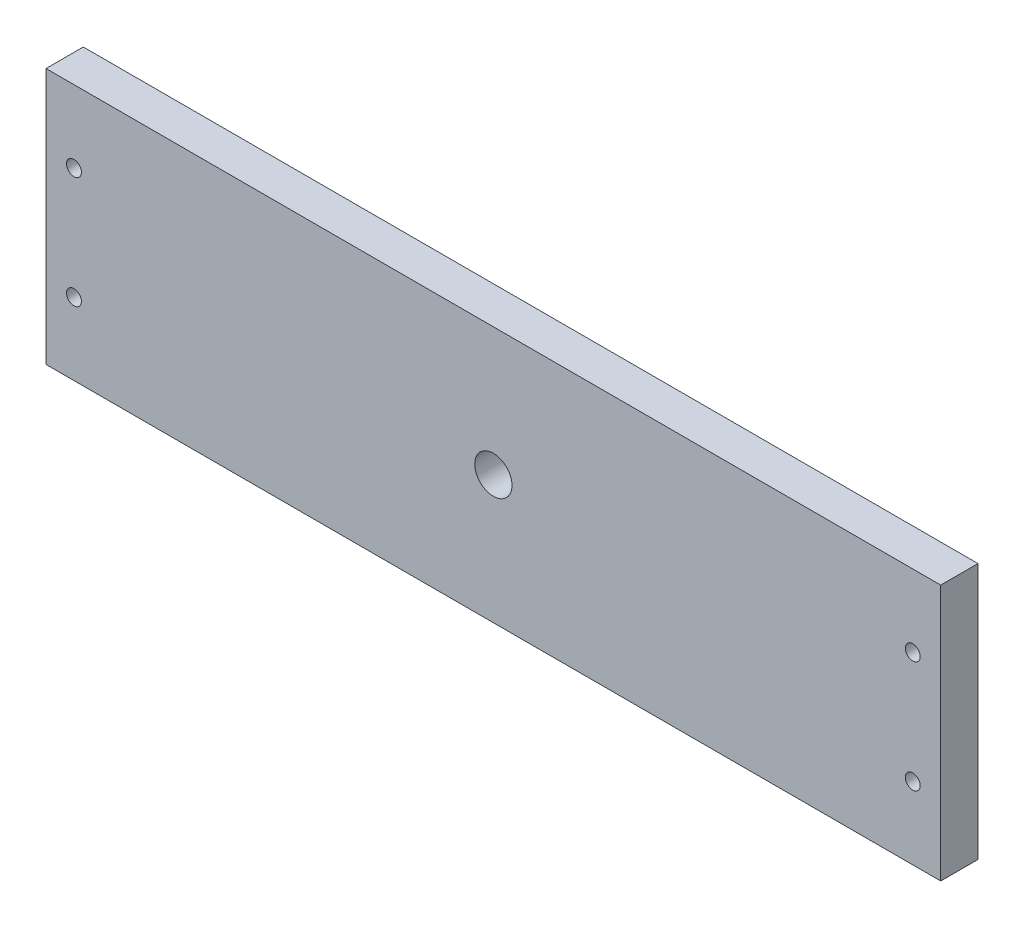
ISO-10303-21;
HEADER;
FILE_DESCRIPTION(('STEP AP214'),'2;1');
FILE_NAME('part.step','',(''),(''),'','','');
FILE_SCHEMA(('AUTOMOTIVE_DESIGN { 1 0 10303 214 1 1 1 1 }'));
ENDSEC;
DATA;
#1=APPLICATION_CONTEXT('core data for automotive mechanical design processes');
#2=APPLICATION_PROTOCOL_DEFINITION('international standard','automotive_design',2000,#1);
#3=PRODUCT_CONTEXT('',#1,'mechanical');
#4=PRODUCT('Part','Part','',(#3));
#5=PRODUCT_RELATED_PRODUCT_CATEGORY('part','',(#4));
#6=PRODUCT_DEFINITION_FORMATION('','',#4);
#7=PRODUCT_DEFINITION_CONTEXT('part definition',#1,'design');
#8=PRODUCT_DEFINITION('design','',#6,#7);
#9=PRODUCT_DEFINITION_SHAPE('','',#8);
#10=(LENGTH_UNIT() NAMED_UNIT(*) SI_UNIT(.MILLI.,.METRE.));
#11=(NAMED_UNIT(*) PLANE_ANGLE_UNIT() SI_UNIT($,.RADIAN.));
#12=(NAMED_UNIT(*) SI_UNIT($,.STERADIAN.) SOLID_ANGLE_UNIT());
#13=UNCERTAINTY_MEASURE_WITH_UNIT(LENGTH_MEASURE(1.E-05),#10,'distance_accuracy_value','');
#14=(GEOMETRIC_REPRESENTATION_CONTEXT(3) GLOBAL_UNCERTAINTY_ASSIGNED_CONTEXT((#13)) GLOBAL_UNIT_ASSIGNED_CONTEXT((#10,
#11,#12)) REPRESENTATION_CONTEXT('',''));
#15=CARTESIAN_POINT('',(0.,0.,0.));
#16=DIRECTION('',(0.,0.,1.));
#17=DIRECTION('',(1.,0.,0.));
#18=AXIS2_PLACEMENT_3D('',#15,#16,#17);
#19=CARTESIAN_POINT('',(-96.,-27.5,8.));
#20=DIRECTION('',(1.,0.,0.));
#21=DIRECTION('',(0.,0.,-1.));
#22=AXIS2_PLACEMENT_3D('',#19,#20,#21);
#23=PLANE('',#22);
#24=DIRECTION('',(0.,-1.,0.));
#25=VECTOR('',#24,1.);
#26=CARTESIAN_POINT('',(-96.,-27.5,0.));
#27=LINE('',#26,#25);
#28=CARTESIAN_POINT('',(-96.,27.5,0.));
#29=VERTEX_POINT('',#28);
#30=CARTESIAN_POINT('',(-96.,-27.5,0.));
#31=VERTEX_POINT('',#30);
#32=EDGE_CURVE('E114',#29,#31,#27,.T.);
#33=ORIENTED_EDGE('',*,*,#32,.T.);
#34=DIRECTION('',(0.,0.,-1.));
#35=VECTOR('',#34,1.);
#36=CARTESIAN_POINT('',(-96.,-27.5,8.));
#37=LINE('',#36,#35);
#38=CARTESIAN_POINT('',(-96.,-27.5,8.));
#39=VERTEX_POINT('',#38);
#40=EDGE_CURVE('E11',#39,#31,#37,.T.);
#41=ORIENTED_EDGE('',*,*,#40,.F.);
#42=DIRECTION('',(0.,-1.,0.));
#43=VECTOR('',#42,1.);
#44=CARTESIAN_POINT('',(-96.,-27.5,8.));
#45=LINE('',#44,#43);
#46=CARTESIAN_POINT('',(-96.,27.5,8.));
#47=VERTEX_POINT('',#46);
#48=EDGE_CURVE('E100',#47,#39,#45,.T.);
#49=ORIENTED_EDGE('',*,*,#48,.F.);
#50=DIRECTION('',(0.,0.,-1.));
#51=VECTOR('',#50,1.);
#52=CARTESIAN_POINT('',(-96.,27.5,8.));
#53=LINE('',#52,#51);
#54=EDGE_CURVE('E108',#47,#29,#53,.T.);
#55=ORIENTED_EDGE('',*,*,#54,.T.);
#56=EDGE_LOOP('',(#33,#41,#49,#55));
#57=FACE_BOUND('',#56,.T.);
#58=ADVANCED_FACE('F44',(#57),#23,.F.);
#59=CARTESIAN_POINT('',(-96.,-27.5,8.));
#60=DIRECTION('',(0.,1.,0.));
#61=DIRECTION('',(0.,0.,1.));
#62=AXIS2_PLACEMENT_3D('',#59,#60,#61);
#63=PLANE('',#62);
#64=DIRECTION('',(1.,0.,0.));
#65=VECTOR('',#64,1.);
#66=CARTESIAN_POINT('',(-96.,-27.5,0.));
#67=LINE('',#66,#65);
#68=CARTESIAN_POINT('',(96.,-27.5,0.));
#69=VERTEX_POINT('',#68);
#70=EDGE_CURVE('E105',#31,#69,#67,.T.);
#71=ORIENTED_EDGE('',*,*,#70,.T.);
#72=DIRECTION('',(0.,0.,-1.));
#73=VECTOR('',#72,1.);
#74=CARTESIAN_POINT('',(96.,-27.5,8.));
#75=LINE('',#74,#73);
#76=CARTESIAN_POINT('',(96.,-27.5,8.));
#77=VERTEX_POINT('',#76);
#78=EDGE_CURVE('E53',#77,#69,#75,.T.);
#79=ORIENTED_EDGE('',*,*,#78,.F.);
#80=DIRECTION('',(1.,0.,0.));
#81=VECTOR('',#80,1.);
#82=CARTESIAN_POINT('',(-96.,-27.5,8.));
#83=LINE('',#82,#81);
#84=EDGE_CURVE('E95',#39,#77,#83,.T.);
#85=ORIENTED_EDGE('',*,*,#84,.F.);
#86=ORIENTED_EDGE('',*,*,#40,.T.);
#87=EDGE_LOOP('',(#71,#79,#85,#86));
#88=FACE_BOUND('',#87,.T.);
#89=ADVANCED_FACE('F101',(#88),#63,.F.);
#90=CARTESIAN_POINT('',(96.,-27.5,8.));
#91=DIRECTION('',(-1.,0.,0.));
#92=DIRECTION('',(0.,0.,1.));
#93=AXIS2_PLACEMENT_3D('',#90,#91,#92);
#94=PLANE('',#93);
#95=DIRECTION('',(0.,1.,0.));
#96=VECTOR('',#95,1.);
#97=CARTESIAN_POINT('',(96.,-27.5,0.));
#98=LINE('',#97,#96);
#99=CARTESIAN_POINT('',(96.,27.5,0.));
#100=VERTEX_POINT('',#99);
#101=EDGE_CURVE('E76',#69,#100,#98,.T.);
#102=ORIENTED_EDGE('',*,*,#101,.T.);
#103=DIRECTION('',(0.,0.,-1.));
#104=VECTOR('',#103,1.);
#105=CARTESIAN_POINT('',(96.,27.5,8.));
#106=LINE('',#105,#104);
#107=CARTESIAN_POINT('',(96.,27.5,8.));
#108=VERTEX_POINT('',#107);
#109=EDGE_CURVE('E102',#108,#100,#106,.T.);
#110=ORIENTED_EDGE('',*,*,#109,.F.);
#111=DIRECTION('',(0.,1.,0.));
#112=VECTOR('',#111,1.);
#113=CARTESIAN_POINT('',(96.,-27.5,8.));
#114=LINE('',#113,#112);
#115=EDGE_CURVE('E92',#77,#108,#114,.T.);
#116=ORIENTED_EDGE('',*,*,#115,.F.);
#117=ORIENTED_EDGE('',*,*,#78,.T.);
#118=EDGE_LOOP('',(#102,#110,#116,#117));
#119=FACE_BOUND('',#118,.T.);
#120=ADVANCED_FACE('F104',(#119),#94,.F.);
#121=CARTESIAN_POINT('',(-96.,27.5,8.));
#122=DIRECTION('',(0.,-1.,0.));
#123=DIRECTION('',(0.,0.,-1.));
#124=AXIS2_PLACEMENT_3D('',#121,#122,#123);
#125=PLANE('',#124);
#126=DIRECTION('',(-1.,0.,0.));
#127=VECTOR('',#126,1.);
#128=CARTESIAN_POINT('',(-96.,27.5,0.));
#129=LINE('',#128,#127);
#130=EDGE_CURVE('E82',#100,#29,#129,.T.);
#131=ORIENTED_EDGE('',*,*,#130,.T.);
#132=ORIENTED_EDGE('',*,*,#54,.F.);
#133=DIRECTION('',(-1.,0.,0.));
#134=VECTOR('',#133,1.);
#135=CARTESIAN_POINT('',(-96.,27.5,8.));
#136=LINE('',#135,#134);
#137=EDGE_CURVE('E65',#108,#47,#136,.T.);
#138=ORIENTED_EDGE('',*,*,#137,.F.);
#139=ORIENTED_EDGE('',*,*,#109,.T.);
#140=EDGE_LOOP('',(#131,#132,#138,#139));
#141=FACE_BOUND('',#140,.T.);
#142=ADVANCED_FACE('F130',(#141),#125,.F.);
#143=CARTESIAN_POINT('',(0.,0.,8.));
#144=DIRECTION('',(0.,0.,-1.));
#145=DIRECTION('',(-1.,0.,0.));
#146=AXIS2_PLACEMENT_3D('',#143,#144,#145);
#147=PLANE('',#146);
#148=CARTESIAN_POINT('',(90.,-12.,8.));
#149=DIRECTION('',(0.,0.,-1.));
#150=DIRECTION('',(-1.,0.,0.));
#151=AXIS2_PLACEMENT_3D('',#148,#149,#150);
#152=CIRCLE('',#151,1.6);
#153=CARTESIAN_POINT('',(88.4,-12.,8.));
#154=VERTEX_POINT('',#153);
#155=EDGE_CURVE('E120',#154,#154,#152,.F.);
#156=ORIENTED_EDGE('',*,*,#155,.F.);
#157=EDGE_LOOP('',(#156));
#158=FACE_BOUND('',#157,.T.);
#159=CARTESIAN_POINT('',(90.,12.,8.));
#160=DIRECTION('',(0.,0.,-1.));
#161=DIRECTION('',(-1.,0.,0.));
#162=AXIS2_PLACEMENT_3D('',#159,#160,#161);
#163=CIRCLE('',#162,1.6);
#164=CARTESIAN_POINT('',(88.4,12.,8.));
#165=VERTEX_POINT('',#164);
#166=EDGE_CURVE('E136',#165,#165,#163,.F.);
#167=ORIENTED_EDGE('',*,*,#166,.F.);
#168=EDGE_LOOP('',(#167));
#169=FACE_BOUND('',#168,.T.);
#170=CARTESIAN_POINT('',(-90.,-12.,8.));
#171=DIRECTION('',(0.,0.,-1.));
#172=DIRECTION('',(-1.,0.,0.));
#173=AXIS2_PLACEMENT_3D('',#170,#171,#172);
#174=CIRCLE('',#173,1.6);
#175=CARTESIAN_POINT('',(-91.6,-12.,8.));
#176=VERTEX_POINT('',#175);
#177=EDGE_CURVE('E143',#176,#176,#174,.F.);
#178=ORIENTED_EDGE('',*,*,#177,.F.);
#179=EDGE_LOOP('',(#178));
#180=FACE_BOUND('',#179,.T.);
#181=CARTESIAN_POINT('',(-90.,12.,8.));
#182=DIRECTION('',(0.,0.,-1.));
#183=DIRECTION('',(-1.,0.,0.));
#184=AXIS2_PLACEMENT_3D('',#181,#182,#183);
#185=CIRCLE('',#184,1.6);
#186=CARTESIAN_POINT('',(-91.6,12.,8.));
#187=VERTEX_POINT('',#186);
#188=EDGE_CURVE('E144',#187,#187,#185,.F.);
#189=ORIENTED_EDGE('',*,*,#188,.F.);
#190=EDGE_LOOP('',(#189));
#191=FACE_BOUND('',#190,.T.);
#192=CARTESIAN_POINT('',(0.,0.,8.));
#193=DIRECTION('',(0.,0.,-1.));
#194=DIRECTION('',(-1.,0.,0.));
#195=AXIS2_PLACEMENT_3D('',#192,#193,#194);
#196=CIRCLE('',#195,4.);
#197=CARTESIAN_POINT('',(-4.,0.,8.));
#198=VERTEX_POINT('',#197);
#199=EDGE_CURVE('E149',#198,#198,#196,.F.);
#200=ORIENTED_EDGE('',*,*,#199,.F.);
#201=EDGE_LOOP('',(#200));
#202=FACE_BOUND('',#201,.T.);
#203=ORIENTED_EDGE('',*,*,#48,.T.);
#204=ORIENTED_EDGE('',*,*,#84,.T.);
#205=ORIENTED_EDGE('',*,*,#115,.T.);
#206=ORIENTED_EDGE('',*,*,#137,.T.);
#207=EDGE_LOOP('',(#203,#204,#205,#206));
#208=FACE_BOUND('',#207,.T.);
#209=ADVANCED_FACE('F91',(#158,#169,#180,#191,#202,#208),#147,.F.);
#210=CARTESIAN_POINT('',(0.,0.,0.));
#211=DIRECTION('',(0.,0.,-1.));
#212=DIRECTION('',(-1.,0.,0.));
#213=AXIS2_PLACEMENT_3D('',#210,#211,#212);
#214=PLANE('',#213);
#215=CARTESIAN_POINT('',(90.,-12.,0.));
#216=DIRECTION('',(0.,0.,1.));
#217=DIRECTION('',(1.,0.,0.));
#218=AXIS2_PLACEMENT_3D('',#215,#216,#217);
#219=CIRCLE('',#218,1.6);
#220=CARTESIAN_POINT('',(91.6,-12.,0.));
#221=VERTEX_POINT('',#220);
#222=EDGE_CURVE('E158',#221,#221,#219,.T.);
#223=ORIENTED_EDGE('',*,*,#222,.T.);
#224=EDGE_LOOP('',(#223));
#225=FACE_BOUND('',#224,.T.);
#226=CARTESIAN_POINT('',(90.,12.,0.));
#227=DIRECTION('',(0.,0.,1.));
#228=DIRECTION('',(1.,0.,0.));
#229=AXIS2_PLACEMENT_3D('',#226,#227,#228);
#230=CIRCLE('',#229,1.6);
#231=CARTESIAN_POINT('',(91.6,12.,0.));
#232=VERTEX_POINT('',#231);
#233=EDGE_CURVE('E165',#232,#232,#230,.T.);
#234=ORIENTED_EDGE('',*,*,#233,.T.);
#235=EDGE_LOOP('',(#234));
#236=FACE_BOUND('',#235,.T.);
#237=CARTESIAN_POINT('',(-90.,-12.,0.));
#238=DIRECTION('',(0.,0.,1.));
#239=DIRECTION('',(1.,0.,0.));
#240=AXIS2_PLACEMENT_3D('',#237,#238,#239);
#241=CIRCLE('',#240,1.6);
#242=CARTESIAN_POINT('',(-88.4,-12.,0.));
#243=VERTEX_POINT('',#242);
#244=EDGE_CURVE('E167',#243,#243,#241,.T.);
#245=ORIENTED_EDGE('',*,*,#244,.T.);
#246=EDGE_LOOP('',(#245));
#247=FACE_BOUND('',#246,.T.);
#248=CARTESIAN_POINT('',(-90.,12.,0.));
#249=DIRECTION('',(0.,0.,1.));
#250=DIRECTION('',(1.,0.,0.));
#251=AXIS2_PLACEMENT_3D('',#248,#249,#250);
#252=CIRCLE('',#251,1.6);
#253=CARTESIAN_POINT('',(-88.4,12.,0.));
#254=VERTEX_POINT('',#253);
#255=EDGE_CURVE('E160',#254,#254,#252,.T.);
#256=ORIENTED_EDGE('',*,*,#255,.T.);
#257=EDGE_LOOP('',(#256));
#258=FACE_BOUND('',#257,.T.);
#259=CARTESIAN_POINT('',(0.,0.,0.));
#260=DIRECTION('',(0.,0.,1.));
#261=DIRECTION('',(1.,0.,0.));
#262=AXIS2_PLACEMENT_3D('',#259,#260,#261);
#263=CIRCLE('',#262,4.);
#264=CARTESIAN_POINT('',(4.,0.,0.));
#265=VERTEX_POINT('',#264);
#266=EDGE_CURVE('E153',#265,#265,#263,.T.);
#267=ORIENTED_EDGE('',*,*,#266,.T.);
#268=EDGE_LOOP('',(#267));
#269=FACE_BOUND('',#268,.T.);
#270=ORIENTED_EDGE('',*,*,#32,.F.);
#271=ORIENTED_EDGE('',*,*,#130,.F.);
#272=ORIENTED_EDGE('',*,*,#101,.F.);
#273=ORIENTED_EDGE('',*,*,#70,.F.);
#274=EDGE_LOOP('',(#270,#271,#272,#273));
#275=FACE_BOUND('',#274,.T.);
#276=ADVANCED_FACE('F128',(#225,#236,#247,#258,#269,#275),#214,.T.);
#277=CARTESIAN_POINT('',(0.,0.,9.));
#278=DIRECTION('',(0.,0.,-1.));
#279=DIRECTION('',(-1.,0.,0.));
#280=AXIS2_PLACEMENT_3D('',#277,#278,#279);
#281=CYLINDRICAL_SURFACE('',#280,4.);
#282=ORIENTED_EDGE('',*,*,#266,.F.);
#283=EDGE_LOOP('',(#282));
#284=FACE_BOUND('',#283,.T.);
#285=ORIENTED_EDGE('',*,*,#199,.T.);
#286=EDGE_LOOP('',(#285));
#287=FACE_BOUND('',#286,.T.);
#288=ADVANCED_FACE('F177',(#284,#287),#281,.F.);
#289=CARTESIAN_POINT('',(-90.,12.,9.));
#290=DIRECTION('',(0.,0.,-1.));
#291=DIRECTION('',(-1.,0.,0.));
#292=AXIS2_PLACEMENT_3D('',#289,#290,#291);
#293=CYLINDRICAL_SURFACE('',#292,1.6);
#294=ORIENTED_EDGE('',*,*,#255,.F.);
#295=EDGE_LOOP('',(#294));
#296=FACE_BOUND('',#295,.T.);
#297=ORIENTED_EDGE('',*,*,#188,.T.);
#298=EDGE_LOOP('',(#297));
#299=FACE_BOUND('',#298,.T.);
#300=ADVANCED_FACE('F179',(#296,#299),#293,.F.);
#301=CARTESIAN_POINT('',(-90.,-12.,9.));
#302=DIRECTION('',(0.,0.,-1.));
#303=DIRECTION('',(-1.,0.,0.));
#304=AXIS2_PLACEMENT_3D('',#301,#302,#303);
#305=CYLINDRICAL_SURFACE('',#304,1.6);
#306=ORIENTED_EDGE('',*,*,#244,.F.);
#307=EDGE_LOOP('',(#306));
#308=FACE_BOUND('',#307,.T.);
#309=ORIENTED_EDGE('',*,*,#177,.T.);
#310=EDGE_LOOP('',(#309));
#311=FACE_BOUND('',#310,.T.);
#312=ADVANCED_FACE('F178',(#308,#311),#305,.F.);
#313=CARTESIAN_POINT('',(90.,12.,9.));
#314=DIRECTION('',(0.,0.,-1.));
#315=DIRECTION('',(-1.,0.,0.));
#316=AXIS2_PLACEMENT_3D('',#313,#314,#315);
#317=CYLINDRICAL_SURFACE('',#316,1.6);
#318=ORIENTED_EDGE('',*,*,#233,.F.);
#319=EDGE_LOOP('',(#318));
#320=FACE_BOUND('',#319,.T.);
#321=ORIENTED_EDGE('',*,*,#166,.T.);
#322=EDGE_LOOP('',(#321));
#323=FACE_BOUND('',#322,.T.);
#324=ADVANCED_FACE('F241',(#320,#323),#317,.F.);
#325=CARTESIAN_POINT('',(90.,-12.,9.));
#326=DIRECTION('',(0.,0.,-1.));
#327=DIRECTION('',(-1.,0.,0.));
#328=AXIS2_PLACEMENT_3D('',#325,#326,#327);
#329=CYLINDRICAL_SURFACE('',#328,1.6);
#330=ORIENTED_EDGE('',*,*,#222,.F.);
#331=EDGE_LOOP('',(#330));
#332=FACE_BOUND('',#331,.T.);
#333=ORIENTED_EDGE('',*,*,#155,.T.);
#334=EDGE_LOOP('',(#333));
#335=FACE_BOUND('',#334,.T.);
#336=ADVANCED_FACE('F255',(#332,#335),#329,.F.);
#337=CLOSED_SHELL('',(#58,#89,#120,#142,#209,#276,#288,#300,#312,#324,#336));
#338=MANIFOLD_SOLID_BREP('B2',#337);
#339=ADVANCED_BREP_SHAPE_REPRESENTATION('',(#18,#338),#14);
#340=SHAPE_DEFINITION_REPRESENTATION(#9,#339);
ENDSEC;
END-ISO-10303-21;
